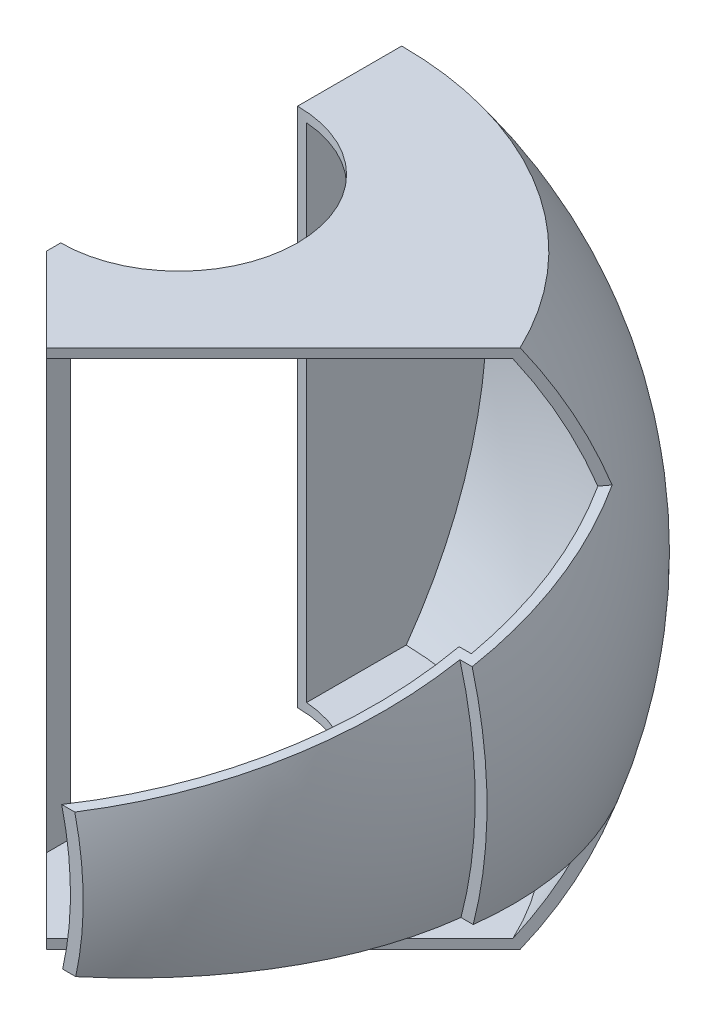
ISO-10303-21;
HEADER;
FILE_DESCRIPTION(('STEP AP214'),'2;1');
FILE_NAME('part.step','',(''),(''),'','','');
FILE_SCHEMA(('AUTOMOTIVE_DESIGN { 1 0 10303 214 1 1 1 1 }'));
ENDSEC;
DATA;
#1=APPLICATION_CONTEXT('core data for automotive mechanical design processes');
#2=APPLICATION_PROTOCOL_DEFINITION('international standard','automotive_design',2000,#1);
#3=PRODUCT_CONTEXT('',#1,'mechanical');
#4=PRODUCT('Part','Part','',(#3));
#5=PRODUCT_RELATED_PRODUCT_CATEGORY('part','',(#4));
#6=PRODUCT_DEFINITION_FORMATION('','',#4);
#7=PRODUCT_DEFINITION_CONTEXT('part definition',#1,'design');
#8=PRODUCT_DEFINITION('design','',#6,#7);
#9=PRODUCT_DEFINITION_SHAPE('','',#8);
#10=(LENGTH_UNIT() NAMED_UNIT(*) SI_UNIT(.MILLI.,.METRE.));
#11=(NAMED_UNIT(*) PLANE_ANGLE_UNIT() SI_UNIT($,.RADIAN.));
#12=(NAMED_UNIT(*) SI_UNIT($,.STERADIAN.) SOLID_ANGLE_UNIT());
#13=UNCERTAINTY_MEASURE_WITH_UNIT(LENGTH_MEASURE(1.E-05),#10,'distance_accuracy_value','');
#14=(GEOMETRIC_REPRESENTATION_CONTEXT(3) GLOBAL_UNCERTAINTY_ASSIGNED_CONTEXT((#13)) GLOBAL_UNIT_ASSIGNED_CONTEXT((#10,
#11,#12)) REPRESENTATION_CONTEXT('',''));
#15=CARTESIAN_POINT('',(0.,0.,0.));
#16=DIRECTION('',(0.,0.,1.));
#17=DIRECTION('',(1.,0.,0.));
#18=AXIS2_PLACEMENT_3D('',#15,#16,#17);
#19=CARTESIAN_POINT('',(-5.2024663463513E-13,55.,-28.));
#20=DIRECTION('',(0.,-1.,0.));
#21=DIRECTION('',(0.,0.,-1.));
#22=AXIS2_PLACEMENT_3D('',#19,#20,#21);
#23=CYLINDRICAL_SURFACE('',#22,25.);
#24=DIRECTION('',(0.,-1.,0.));
#25=VECTOR('',#24,1.);
#26=CARTESIAN_POINT('',(-3.70097021917372E-13,55.,-53.));
#27=LINE('',#26,#25);
#28=CARTESIAN_POINT('',(-3.70097021917372E-13,55.,-53.));
#29=VERTEX_POINT('',#28);
#30=CARTESIAN_POINT('',(-3.70097021917372E-13,-55.,-53.));
#31=VERTEX_POINT('',#30);
#32=EDGE_CURVE('E259',#29,#31,#27,.T.);
#33=ORIENTED_EDGE('',*,*,#32,.T.);
#34=CARTESIAN_POINT('',(-5.2024663463513E-13,-55.,-28.));
#35=DIRECTION('',(0.,-1.,0.));
#36=DIRECTION('',(0.,0.,-1.));
#37=AXIS2_PLACEMENT_3D('',#34,#35,#36);
#38=CIRCLE('',#37,25.);
#39=CARTESIAN_POINT('',(0.,-55.,-3.));
#40=VERTEX_POINT('',#39);
#41=EDGE_CURVE('E239',#31,#40,#38,.T.);
#42=ORIENTED_EDGE('',*,*,#41,.T.);
#43=DIRECTION('',(0.,-1.,0.));
#44=VECTOR('',#43,1.);
#45=CARTESIAN_POINT('',(0.,55.,-3.));
#46=LINE('',#45,#44);
#47=CARTESIAN_POINT('',(0.,55.,-3.));
#48=VERTEX_POINT('',#47);
#49=EDGE_CURVE('E256',#40,#48,#46,.F.);
#50=ORIENTED_EDGE('',*,*,#49,.T.);
#51=CARTESIAN_POINT('',(-5.2024663463513E-13,55.,-28.));
#52=DIRECTION('',(0.,-1.,0.));
#53=DIRECTION('',(0.,0.,-1.));
#54=AXIS2_PLACEMENT_3D('',#51,#52,#53);
#55=CIRCLE('',#54,25.);
#56=EDGE_CURVE('E253',#29,#48,#55,.T.);
#57=ORIENTED_EDGE('',*,*,#56,.F.);
#58=EDGE_LOOP('',(#33,#42,#50,#57));
#59=FACE_BOUND('',#58,.T.);
#60=DIRECTION('',(0.,-1.,0.));
#61=VECTOR('',#60,1.);
#62=CARTESIAN_POINT('',(1.99999999999963,53.,-52.9198715887542));
#63=LINE('',#62,#61);
#64=CARTESIAN_POINT('',(1.99999999999963,53.,-52.9198715887542));
#65=VERTEX_POINT('',#64);
#66=CARTESIAN_POINT('',(1.99999999999963,-53.,-52.9198715887542));
#67=VERTEX_POINT('',#66);
#68=EDGE_CURVE('E219',#65,#67,#63,.T.);
#69=ORIENTED_EDGE('',*,*,#68,.F.);
#70=CARTESIAN_POINT('',(-5.2024663463513E-13,53.,-28.));
#71=DIRECTION('',(0.,-1.,0.));
#72=DIRECTION('',(0.,0.,-1.));
#73=AXIS2_PLACEMENT_3D('',#70,#71,#72);
#74=CIRCLE('',#73,25.);
#75=CARTESIAN_POINT('',(1.99999999999998,53.,-3.08012841124581));
#76=VERTEX_POINT('',#75);
#77=EDGE_CURVE('E186',#65,#76,#74,.T.);
#78=ORIENTED_EDGE('',*,*,#77,.T.);
#79=DIRECTION('',(0.,-1.,0.));
#80=VECTOR('',#79,1.);
#81=CARTESIAN_POINT('',(1.99999999999998,-53.,-3.08012841124581));
#82=LINE('',#81,#80);
#83=CARTESIAN_POINT('',(1.99999999999998,-53.,-3.08012841124581));
#84=VERTEX_POINT('',#83);
#85=EDGE_CURVE('E221',#84,#76,#82,.F.);
#86=ORIENTED_EDGE('',*,*,#85,.F.);
#87=CARTESIAN_POINT('',(-5.2024663463513E-13,-53.,-28.));
#88=DIRECTION('',(0.,1.,0.));
#89=DIRECTION('',(0.,0.,1.));
#90=AXIS2_PLACEMENT_3D('',#87,#88,#89);
#91=CIRCLE('',#90,25.);
#92=EDGE_CURVE('E222',#67,#84,#91,.F.);
#93=ORIENTED_EDGE('',*,*,#92,.F.);
#94=EDGE_LOOP('',(#69,#78,#86,#93));
#95=FACE_BOUND('',#94,.T.);
#96=ADVANCED_FACE('F43',(#59,#95),#23,.F.);
#97=CARTESIAN_POINT('',(0.,0.,0.));
#98=DIRECTION('',(-1.,0.,0.));
#99=DIRECTION('',(0.,0.,1.));
#100=AXIS2_PLACEMENT_3D('',#97,#98,#99);
#101=PLANE('',#100);
#102=ORIENTED_EDGE('',*,*,#32,.F.);
#103=DIRECTION('',(0.,0.,-1.));
#104=VECTOR('',#103,1.);
#105=CARTESIAN_POINT('',(0.,55.,0.));
#106=LINE('',#105,#104);
#107=CARTESIAN_POINT('',(-5.23675645672742E-13,55.,-74.9933330370107));
#108=VERTEX_POINT('',#107);
#109=EDGE_CURVE('E325',#29,#108,#106,.T.);
#110=ORIENTED_EDGE('',*,*,#109,.T.);
#111=CARTESIAN_POINT('',(0.,0.,0.));
#112=DIRECTION('',(-1.,0.,0.));
#113=DIRECTION('',(0.,0.,1.));
#114=AXIS2_PLACEMENT_3D('',#111,#112,#113);
#115=CIRCLE('',#114,93.);
#116=CARTESIAN_POINT('',(-5.23675645672742E-13,-55.,-74.9933330370107));
#117=VERTEX_POINT('',#116);
#118=EDGE_CURVE('E290',#108,#117,#115,.T.);
#119=ORIENTED_EDGE('',*,*,#118,.T.);
#120=DIRECTION('',(0.,0.,1.));
#121=VECTOR('',#120,1.);
#122=CARTESIAN_POINT('',(0.,-55.,0.));
#123=LINE('',#122,#121);
#124=EDGE_CURVE('E322',#117,#31,#123,.T.);
#125=ORIENTED_EDGE('',*,*,#124,.T.);
#126=EDGE_LOOP('',(#102,#110,#119,#125));
#127=FACE_BOUND('',#126,.T.);
#128=ADVANCED_FACE('F400',(#127),#101,.T.);
#129=CARTESIAN_POINT('',(-121.513111323989,15.4248311153682,60.));
#130=DIRECTION('',(0.,0.990074030670296,0.140546838428599));
#131=DIRECTION('',(0.,-0.140546838428599,0.990074030670296));
#132=AXIS2_PLACEMENT_3D('',#129,#130,#131);
#133=PLANE('',#132);
#134=CARTESIAN_POINT('',(0.,23.4692445329286,3.33159745355368));
#135=DIRECTION('',(0.,0.990074030670296,0.140546838428599));
#136=DIRECTION('',(0.,-0.140546838428599,0.990074030670296));
#137=AXIS2_PLACEMENT_3D('',#134,#135,#136);
#138=CIRCLE('',#137,85.266318200454);
#139=CARTESIAN_POINT('',(63.2006691820772,15.4248311153682,60.));
#140=VERTEX_POINT('',#139);
#141=CARTESIAN_POINT('',(85.0961001669933,24.226096185086,-2.0000000000003));
#142=VERTEX_POINT('',#141);
#143=EDGE_CURVE('E209',#140,#142,#138,.T.);
#144=ORIENTED_EDGE('',*,*,#143,.F.);
#145=DIRECTION('',(1.,0.,0.));
#146=VECTOR('',#145,1.);
#147=CARTESIAN_POINT('',(-121.513111323989,15.4248311153682,60.));
#148=LINE('',#147,#146);
#149=CARTESIAN_POINT('',(65.9721500715443,15.4248311153682,60.));
#150=VERTEX_POINT('',#149);
#151=EDGE_CURVE('E293',#140,#150,#148,.T.);
#152=ORIENTED_EDGE('',*,*,#151,.T.);
#153=CARTESIAN_POINT('',(0.,23.4692445329286,3.33159745355368));
#154=DIRECTION('',(0.,0.990074030670296,0.140546838428599));
#155=DIRECTION('',(0.,-0.140546838428599,0.990074030670296));
#156=AXIS2_PLACEMENT_3D('',#153,#154,#155);
#157=CIRCLE('',#156,87.3403974084219);
#158=CARTESIAN_POINT('',(87.275551019415,23.9421844086435,-3.04720957721539E-13));
#159=VERTEX_POINT('',#158);
#160=EDGE_CURVE('E271',#150,#159,#157,.T.);
#161=ORIENTED_EDGE('',*,*,#160,.T.);
#162=DIRECTION('',(-1.,0.,0.));
#163=VECTOR('',#162,1.);
#164=CARTESIAN_POINT('',(-121.513111323989,23.9421844086434,4.23272528138341E-13));
#165=LINE('',#164,#163);
#166=CARTESIAN_POINT('',(89.8652981174742,23.9421844086435,-3.13657139834772E-13));
#167=VERTEX_POINT('',#166);
#168=EDGE_CURVE('E266',#167,#159,#165,.T.);
#169=ORIENTED_EDGE('',*,*,#168,.F.);
#170=CARTESIAN_POINT('',(0.,23.4692445329286,3.33159745355368));
#171=DIRECTION('',(0.,0.990074030670296,0.140546838428599));
#172=DIRECTION('',(0.,-0.140546838428599,0.990074030670296));
#173=AXIS2_PLACEMENT_3D('',#170,#171,#172);
#174=CIRCLE('',#173,89.928277084914);
#175=CARTESIAN_POINT('',(77.3831743114521,29.9082830918752,-42.0278352521239));
#176=VERTEX_POINT('',#175);
#177=EDGE_CURVE('E282',#167,#176,#174,.T.);
#178=ORIENTED_EDGE('',*,*,#177,.T.);
#179=DIRECTION('',(0.703571165799075,0.0998760697678693,-0.703571165799064));
#180=VECTOR('',#179,1.);
#181=CARTESIAN_POINT('',(20.0364386421746,21.7675762933536,15.3189004171528));
#182=LINE('',#181,#180);
#183=CARTESIAN_POINT('',(75.8766441195315,29.694422260349,-40.5213050602033));
#184=VERTEX_POINT('',#183);
#185=EDGE_CURVE('E300',#184,#176,#182,.T.);
#186=ORIENTED_EDGE('',*,*,#185,.F.);
#187=CARTESIAN_POINT('',(0.,23.4692445329286,3.33159745355368));
#188=DIRECTION('',(0.,0.990074030670296,0.140546838428599));
#189=DIRECTION('',(0.,-0.140546838428599,0.990074030670296));
#190=AXIS2_PLACEMENT_3D('',#187,#188,#189);
#191=CIRCLE('',#190,87.858380473698);
#192=CARTESIAN_POINT('',(87.6931939413257,24.226096185086,-2.00000000000031));
#193=VERTEX_POINT('',#192);
#194=EDGE_CURVE('E207',#193,#184,#191,.T.);
#195=ORIENTED_EDGE('',*,*,#194,.F.);
#196=DIRECTION('',(-1.,0.,0.));
#197=VECTOR('',#196,1.);
#198=CARTESIAN_POINT('',(-121.513111323989,24.2260961850859,-1.99999999999957));
#199=LINE('',#198,#197);
#200=EDGE_CURVE('E235',#193,#142,#199,.T.);
#201=ORIENTED_EDGE('',*,*,#200,.T.);
#202=EDGE_LOOP('',(#144,#152,#161,#169,#178,#186,#195,#201));
#203=FACE_BOUND('',#202,.T.);
#204=ADVANCED_FACE('F338',(#203),#133,.T.);
#205=CARTESIAN_POINT('',(-121.513111323989,-14.5751688846318,60.));
#206=DIRECTION('',(0.,-0.990074030670296,0.140546838428599));
#207=DIRECTION('',(0.,-0.140546838428599,-0.990074030670296));
#208=AXIS2_PLACEMENT_3D('',#205,#206,#207);
#209=PLANE('',#208);
#210=CARTESIAN_POINT('',(0.,-22.6363660318196,3.21336544614836));
#211=DIRECTION('',(0.,-0.990074030670296,0.140546838428599));
#212=DIRECTION('',(0.,-0.140546838428599,-0.990074030670296));
#213=AXIS2_PLACEMENT_3D('',#210,#211,#212);
#214=CIRCLE('',#213,85.4957262989384);
#215=CARTESIAN_POINT('',(85.333418632901,-23.3764339543496,-2.0000000000003));
#216=VERTEX_POINT('',#215);
#217=CARTESIAN_POINT('',(63.4020066873633,-14.5751688846318,60.));
#218=VERTEX_POINT('',#217);
#219=EDGE_CURVE('E236',#216,#218,#214,.T.);
#220=ORIENTED_EDGE('',*,*,#219,.F.);
#221=DIRECTION('',(1.,0.,0.));
#222=VECTOR('',#221,1.);
#223=CARTESIAN_POINT('',(-121.513111323989,-23.3764339543495,-1.99999999999958));
#224=LINE('',#223,#222);
#225=CARTESIAN_POINT('',(87.9235027485708,-23.3764339543496,-2.00000000000031));
#226=VERTEX_POINT('',#225);
#227=EDGE_CURVE('E218',#216,#226,#224,.T.);
#228=ORIENTED_EDGE('',*,*,#227,.T.);
#229=CARTESIAN_POINT('',(0.,-22.6363660318196,3.21336544614836));
#230=DIRECTION('',(0.,-0.990074030670296,0.140546838428599));
#231=DIRECTION('',(0.,-0.140546838428599,-0.990074030670296));
#232=AXIS2_PLACEMENT_3D('',#229,#230,#231);
#233=CIRCLE('',#232,88.0810377742167);
#234=CARTESIAN_POINT('',(76.082684812944,-28.8740087192557,-40.7273457536158));
#235=VERTEX_POINT('',#234);
#236=EDGE_CURVE('E203',#235,#226,#233,.T.);
#237=ORIENTED_EDGE('',*,*,#236,.F.);
#238=DIRECTION('',(-0.703571165799075,0.0998760697678691,0.703571165799064));
#239=VECTOR('',#238,1.);
#240=CARTESIAN_POINT('',(12.3664528289492,-19.8291144138564,22.9888862303781));
#241=LINE('',#240,#239);
#242=CARTESIAN_POINT('',(77.5856219144432,-29.0873594904397,-42.2302828551149));
#243=VERTEX_POINT('',#242);
#244=EDGE_CURVE('E296',#243,#235,#241,.T.);
#245=ORIENTED_EDGE('',*,*,#244,.F.);
#246=CARTESIAN_POINT('',(0.,-22.6363660318196,3.21336544614836));
#247=DIRECTION('',(0.,-0.990074030670296,0.140546838428599));
#248=DIRECTION('',(0.,-0.140546838428599,-0.990074030670296));
#249=AXIS2_PLACEMENT_3D('',#246,#247,#248);
#250=CIRCLE('',#249,90.1458219518963);
#251=CARTESIAN_POINT('',(90.0873765821986,-23.0925221779071,-3.14695352545935E-13));
#252=VERTEX_POINT('',#251);
#253=EDGE_CURVE('E279',#243,#252,#250,.T.);
#254=ORIENTED_EDGE('',*,*,#253,.T.);
#255=DIRECTION('',(1.,0.,0.));
#256=VECTOR('',#255,1.);
#257=CARTESIAN_POINT('',(-121.513111323989,-23.092522177907,4.23272528138341E-13));
#258=LINE('',#257,#256);
#259=CARTESIAN_POINT('',(87.5042022960205,-23.0925221779071,-3.0551928938691E-13));
#260=VERTEX_POINT('',#259);
#261=EDGE_CURVE('E264',#260,#252,#258,.T.);
#262=ORIENTED_EDGE('',*,*,#261,.F.);
#263=CARTESIAN_POINT('',(0.,-22.6363660318196,3.21336544614836));
#264=DIRECTION('',(0.,-0.990074030670296,0.140546838428599));
#265=DIRECTION('',(0.,-0.140546838428599,-0.990074030670296));
#266=AXIS2_PLACEMENT_3D('',#263,#264,#265);
#267=CIRCLE('',#266,87.5643718379969);
#268=CARTESIAN_POINT('',(66.1650546133263,-14.5751688846318,60.));
#269=VERTEX_POINT('',#268);
#270=EDGE_CURVE('E268',#260,#269,#267,.T.);
#271=ORIENTED_EDGE('',*,*,#270,.T.);
#272=DIRECTION('',(1.,0.,0.));
#273=VECTOR('',#272,1.);
#274=CARTESIAN_POINT('',(-121.513111323989,-14.5751688846318,60.));
#275=LINE('',#274,#273);
#276=EDGE_CURVE('E294',#218,#269,#275,.T.);
#277=ORIENTED_EDGE('',*,*,#276,.F.);
#278=EDGE_LOOP('',(#220,#228,#237,#245,#254,#262,#271,#277));
#279=FACE_BOUND('',#278,.T.);
#280=ADVANCED_FACE('F396',(#279),#209,.T.);
#281=CARTESIAN_POINT('',(-121.513111323989,-14.5751688846318,60.));
#282=DIRECTION('',(0.,0.,1.));
#283=DIRECTION('',(0.,-1.,0.));
#284=AXIS2_PLACEMENT_3D('',#281,#282,#283);
#285=PLANE('',#284);
#286=CARTESIAN_POINT('',(0.,0.,60.));
#287=DIRECTION('',(0.,0.,1.));
#288=DIRECTION('',(0.,-1.,0.));
#289=AXIS2_PLACEMENT_3D('',#286,#287,#288);
#290=CIRCLE('',#289,65.0557453266043);
#291=EDGE_CURVE('E215',#218,#140,#290,.T.);
#292=ORIENTED_EDGE('',*,*,#291,.F.);
#293=ORIENTED_EDGE('',*,*,#276,.T.);
#294=CARTESIAN_POINT('',(0.,0.,60.));
#295=DIRECTION('',(0.,0.,1.));
#296=DIRECTION('',(0.,-1.,0.));
#297=AXIS2_PLACEMENT_3D('',#294,#295,#296);
#298=CIRCLE('',#297,67.7513837497065);
#299=EDGE_CURVE('E11',#269,#150,#298,.T.);
#300=ORIENTED_EDGE('',*,*,#299,.T.);
#301=ORIENTED_EDGE('',*,*,#151,.F.);
#302=EDGE_LOOP('',(#292,#293,#300,#301));
#303=FACE_BOUND('',#302,.T.);
#304=ADVANCED_FACE('F390',(#303),#285,.T.);
#305=CARTESIAN_POINT('',(17.6776695296636,55.,17.6776695296638));
#306=DIRECTION('',(-0.707106781186542,0.,-0.707106781186553));
#307=DIRECTION('',(-0.707106781186553,0.,0.707106781186542));
#308=AXIS2_PLACEMENT_3D('',#305,#306,#307);
#309=PLANE('',#308);
#310=DIRECTION('',(0.707106781186553,0.,-0.707106781186542));
#311=VECTOR('',#310,1.);
#312=CARTESIAN_POINT('',(17.6776695296636,53.,17.6776695296638));
#313=LINE('',#312,#311);
#314=CARTESIAN_POINT('',(17.6776695296636,53.,17.6776695296638));
#315=VERTEX_POINT('',#314);
#316=CARTESIAN_POINT('',(66.9067259902543,53.,-31.5513869309262));
#317=VERTEX_POINT('',#316);
#318=EDGE_CURVE('E246',#315,#317,#313,.T.);
#319=ORIENTED_EDGE('',*,*,#318,.T.);
#320=CARTESIAN_POINT('',(17.6776695296636,0.,17.6776695296638));
#321=DIRECTION('',(-0.707106781186542,0.,-0.707106781186553));
#322=DIRECTION('',(-0.707106781186553,0.,0.707106781186542));
#323=AXIS2_PLACEMENT_3D('',#320,#321,#322);
#324=CIRCLE('',#323,87.4985714169094);
#325=EDGE_CURVE('E198',#317,#184,#324,.T.);
#326=ORIENTED_EDGE('',*,*,#325,.T.);
#327=ORIENTED_EDGE('',*,*,#185,.T.);
#328=CARTESIAN_POINT('',(17.6776695296636,0.,17.6776695296638));
#329=DIRECTION('',(-0.707106781186542,0.,-0.707106781186553));
#330=DIRECTION('',(-0.707106781186553,0.,0.707106781186542));
#331=AXIS2_PLACEMENT_3D('',#328,#329,#330);
#332=CIRCLE('',#331,89.5767827062348);
#333=CARTESIAN_POINT('',(67.6726692796389,55.,-32.3173302203108));
#334=VERTEX_POINT('',#333);
#335=EDGE_CURVE('E287',#334,#176,#332,.T.);
#336=ORIENTED_EDGE('',*,*,#335,.F.);
#337=DIRECTION('',(0.707106781186553,0.,-0.707106781186542));
#338=VECTOR('',#337,1.);
#339=CARTESIAN_POINT('',(17.6776695296636,55.,17.6776695296638));
#340=LINE('',#339,#338);
#341=CARTESIAN_POINT('',(17.6776695296636,55.,17.6776695296638));
#342=VERTEX_POINT('',#341);
#343=EDGE_CURVE('E306',#342,#334,#340,.T.);
#344=ORIENTED_EDGE('',*,*,#343,.F.);
#345=DIRECTION('',(0.,-1.,0.));
#346=VECTOR('',#345,1.);
#347=CARTESIAN_POINT('',(17.6776695296636,55.,17.6776695296638));
#348=LINE('',#347,#346);
#349=EDGE_CURVE('E319',#342,#315,#348,.T.);
#350=ORIENTED_EDGE('',*,*,#349,.T.);
#351=EDGE_LOOP('',(#319,#326,#327,#336,#344,#350));
#352=FACE_BOUND('',#351,.T.);
#353=ADVANCED_FACE('F347',(#352),#309,.F.);
#354=ORIENTED_EDGE('',*,*,#49,.F.);
#355=CARTESIAN_POINT('',(0.,-55.,0.));
#356=VERTEX_POINT('',#355);
#357=EDGE_CURVE('E318',#40,#356,#123,.T.);
#358=ORIENTED_EDGE('',*,*,#357,.T.);
#359=DIRECTION('',(0.,-1.,0.));
#360=VECTOR('',#359,1.);
#361=CARTESIAN_POINT('',(0.,55.,0.));
#362=LINE('',#361,#360);
#363=CARTESIAN_POINT('',(0.,55.,0.));
#364=VERTEX_POINT('',#363);
#365=EDGE_CURVE('E315',#364,#356,#362,.T.);
#366=ORIENTED_EDGE('',*,*,#365,.F.);
#367=EDGE_CURVE('E326',#364,#48,#106,.T.);
#368=ORIENTED_EDGE('',*,*,#367,.T.);
#369=EDGE_LOOP('',(#354,#358,#366,#368));
#370=FACE_BOUND('',#369,.T.);
#371=ADVANCED_FACE('F357',(#370),#101,.T.);
#372=CARTESIAN_POINT('',(0.,-55.,0.));
#373=DIRECTION('',(0.,1.,0.));
#374=DIRECTION('',(0.,0.,1.));
#375=AXIS2_PLACEMENT_3D('',#372,#373,#374);
#376=PLANE('',#375);
#377=ORIENTED_EDGE('',*,*,#357,.F.);
#378=ORIENTED_EDGE('',*,*,#41,.F.);
#379=ORIENTED_EDGE('',*,*,#124,.F.);
#380=CARTESIAN_POINT('',(0.,-55.,0.));
#381=DIRECTION('',(0.,-1.,0.));
#382=DIRECTION('',(0.,0.,-1.));
#383=AXIS2_PLACEMENT_3D('',#380,#381,#382);
#384=CIRCLE('',#383,74.9933330370107);
#385=CARTESIAN_POINT('',(67.6726692796389,-55.,-32.3173302203108));
#386=VERTEX_POINT('',#385);
#387=EDGE_CURVE('E274',#117,#386,#384,.T.);
#388=ORIENTED_EDGE('',*,*,#387,.T.);
#389=DIRECTION('',(0.707106781186553,0.,-0.707106781186542));
#390=VECTOR('',#389,1.);
#391=CARTESIAN_POINT('',(17.6776695296636,-55.,17.6776695296638));
#392=LINE('',#391,#390);
#393=CARTESIAN_POINT('',(17.6776695296636,-55.,17.6776695296638));
#394=VERTEX_POINT('',#393);
#395=EDGE_CURVE('E307',#394,#386,#392,.T.);
#396=ORIENTED_EDGE('',*,*,#395,.F.);
#397=DIRECTION('',(0.707106781186542,0.,0.707106781186553));
#398=VECTOR('',#397,1.);
#399=CARTESIAN_POINT('',(0.,-55.,0.));
#400=LINE('',#399,#398);
#401=EDGE_CURVE('E302',#356,#394,#400,.T.);
#402=ORIENTED_EDGE('',*,*,#401,.F.);
#403=EDGE_LOOP('',(#377,#378,#379,#388,#396,#402));
#404=FACE_BOUND('',#403,.T.);
#405=ADVANCED_FACE('F361',(#404),#376,.F.);
#406=CARTESIAN_POINT('',(0.,55.,0.));
#407=DIRECTION('',(0.,-1.,0.));
#408=DIRECTION('',(0.,0.,-1.));
#409=AXIS2_PLACEMENT_3D('',#406,#407,#408);
#410=PLANE('',#409);
#411=ORIENTED_EDGE('',*,*,#109,.F.);
#412=ORIENTED_EDGE('',*,*,#56,.T.);
#413=ORIENTED_EDGE('',*,*,#367,.F.);
#414=DIRECTION('',(0.707106781186542,0.,0.707106781186553));
#415=VECTOR('',#414,1.);
#416=CARTESIAN_POINT('',(0.,55.,0.));
#417=LINE('',#416,#415);
#418=EDGE_CURVE('E303',#364,#342,#417,.T.);
#419=ORIENTED_EDGE('',*,*,#418,.T.);
#420=ORIENTED_EDGE('',*,*,#343,.T.);
#421=CARTESIAN_POINT('',(0.,55.,0.));
#422=DIRECTION('',(0.,-1.,0.));
#423=DIRECTION('',(0.,0.,-1.));
#424=AXIS2_PLACEMENT_3D('',#421,#422,#423);
#425=CIRCLE('',#424,74.9933330370107);
#426=EDGE_CURVE('E277',#108,#334,#425,.T.);
#427=ORIENTED_EDGE('',*,*,#426,.F.);
#428=EDGE_LOOP('',(#411,#412,#413,#419,#420,#427));
#429=FACE_BOUND('',#428,.T.);
#430=ADVANCED_FACE('F45',(#429),#410,.F.);
#431=ORIENTED_EDGE('',*,*,#244,.T.);
#432=CARTESIAN_POINT('',(17.6776695296636,0.,17.6776695296638));
#433=DIRECTION('',(-0.707106781186542,0.,-0.707106781186553));
#434=DIRECTION('',(-0.707106781186553,0.,0.707106781186542));
#435=AXIS2_PLACEMENT_3D('',#432,#433,#434);
#436=CIRCLE('',#435,87.4985714169094);
#437=CARTESIAN_POINT('',(66.9067259902543,-53.,-31.5513869309262));
#438=VERTEX_POINT('',#437);
#439=EDGE_CURVE('E230',#235,#438,#436,.T.);
#440=ORIENTED_EDGE('',*,*,#439,.T.);
#441=DIRECTION('',(0.707106781186553,0.,-0.707106781186542));
#442=VECTOR('',#441,1.);
#443=CARTESIAN_POINT('',(17.6776695296636,-53.,17.6776695296638));
#444=LINE('',#443,#442);
#445=CARTESIAN_POINT('',(17.6776695296636,-53.,17.6776695296638));
#446=VERTEX_POINT('',#445);
#447=EDGE_CURVE('E226',#446,#438,#444,.T.);
#448=ORIENTED_EDGE('',*,*,#447,.F.);
#449=EDGE_CURVE('E310',#446,#394,#348,.T.);
#450=ORIENTED_EDGE('',*,*,#449,.T.);
#451=ORIENTED_EDGE('',*,*,#395,.T.);
#452=CARTESIAN_POINT('',(17.6776695296636,0.,17.6776695296638));
#453=DIRECTION('',(-0.707106781186542,0.,-0.707106781186553));
#454=DIRECTION('',(-0.707106781186553,0.,0.707106781186542));
#455=AXIS2_PLACEMENT_3D('',#452,#453,#454);
#456=CIRCLE('',#455,89.5767827062348);
#457=EDGE_CURVE('E285',#243,#386,#456,.T.);
#458=ORIENTED_EDGE('',*,*,#457,.F.);
#459=EDGE_LOOP('',(#431,#440,#448,#450,#451,#458));
#460=FACE_BOUND('',#459,.T.);
#461=ADVANCED_FACE('F368',(#460),#309,.F.);
#462=CARTESIAN_POINT('',(0.,55.,0.));
#463=DIRECTION('',(0.707106781186553,0.,-0.707106781186542));
#464=DIRECTION('',(-0.707106781186542,0.,-0.707106781186553));
#465=AXIS2_PLACEMENT_3D('',#462,#463,#464);
#466=PLANE('',#465);
#467=DIRECTION('',(0.,-1.,0.));
#468=VECTOR('',#467,1.);
#469=CARTESIAN_POINT('',(2.00000000000001,0.,2.00000000000004));
#470=LINE('',#469,#468);
#471=CARTESIAN_POINT('',(2.00000000000001,53.,2.00000000000004));
#472=VERTEX_POINT('',#471);
#473=CARTESIAN_POINT('',(2.00000000000001,-53.,2.00000000000004));
#474=VERTEX_POINT('',#473);
#475=EDGE_CURVE('E58',#472,#474,#470,.T.);
#476=ORIENTED_EDGE('',*,*,#475,.F.);
#477=DIRECTION('',(0.707106781186542,0.,0.707106781186553));
#478=VECTOR('',#477,1.);
#479=CARTESIAN_POINT('',(0.,53.,0.));
#480=LINE('',#479,#478);
#481=EDGE_CURVE('E229',#472,#315,#480,.T.);
#482=ORIENTED_EDGE('',*,*,#481,.T.);
#483=ORIENTED_EDGE('',*,*,#349,.F.);
#484=ORIENTED_EDGE('',*,*,#418,.F.);
#485=ORIENTED_EDGE('',*,*,#365,.T.);
#486=ORIENTED_EDGE('',*,*,#401,.T.);
#487=ORIENTED_EDGE('',*,*,#449,.F.);
#488=DIRECTION('',(0.707106781186542,0.,0.707106781186553));
#489=VECTOR('',#488,1.);
#490=CARTESIAN_POINT('',(0.,-53.,0.));
#491=LINE('',#490,#489);
#492=EDGE_CURVE('E197',#474,#446,#491,.T.);
#493=ORIENTED_EDGE('',*,*,#492,.F.);
#494=EDGE_LOOP('',(#476,#482,#483,#484,#485,#486,#487,#493));
#495=FACE_BOUND('',#494,.T.);
#496=ADVANCED_FACE('F353',(#495),#466,.F.);
#497=CARTESIAN_POINT('',(0.,0.,0.));
#498=DIRECTION('',(0.,-1.,0.));
#499=DIRECTION('',(0.,0.,1.));
#500=AXIS2_PLACEMENT_3D('',#497,#498,#499);
#501=SPHERICAL_SURFACE('',#500,93.);
#502=CARTESIAN_POINT('',(0.,0.,0.));
#503=DIRECTION('',(0.,0.,-1.));
#504=DIRECTION('',(-1.,0.,0.));
#505=AXIS2_PLACEMENT_3D('',#502,#503,#504);
#506=CIRCLE('',#505,93.);
#507=EDGE_CURVE('E51',#252,#167,#506,.F.);
#508=ORIENTED_EDGE('',*,*,#507,.F.);
#509=ORIENTED_EDGE('',*,*,#253,.F.);
#510=ORIENTED_EDGE('',*,*,#457,.T.);
#511=ORIENTED_EDGE('',*,*,#387,.F.);
#512=ORIENTED_EDGE('',*,*,#118,.F.);
#513=ORIENTED_EDGE('',*,*,#426,.T.);
#514=ORIENTED_EDGE('',*,*,#335,.T.);
#515=ORIENTED_EDGE('',*,*,#177,.F.);
#516=EDGE_LOOP('',(#508,#509,#510,#511,#512,#513,#514,#515));
#517=FACE_BOUND('',#516,.T.);
#518=ADVANCED_FACE('F341',(#517),#501,.T.);
#519=CARTESIAN_POINT('',(0.,0.,0.));
#520=DIRECTION('',(0.,-1.,0.));
#521=DIRECTION('',(1.,0.,0.));
#522=AXIS2_PLACEMENT_3D('',#519,#520,#521);
#523=SPHERICAL_SURFACE('',#522,90.5);
#524=ORIENTED_EDGE('',*,*,#299,.F.);
#525=ORIENTED_EDGE('',*,*,#270,.F.);
#526=CARTESIAN_POINT('',(0.,0.,0.));
#527=DIRECTION('',(0.,0.,1.));
#528=DIRECTION('',(-1.,0.,0.));
#529=AXIS2_PLACEMENT_3D('',#526,#527,#528);
#530=CIRCLE('',#529,90.5);
#531=EDGE_CURVE('E261',#260,#159,#530,.T.);
#532=ORIENTED_EDGE('',*,*,#531,.T.);
#533=ORIENTED_EDGE('',*,*,#160,.F.);
#534=EDGE_LOOP('',(#524,#525,#532,#533));
#535=FACE_BOUND('',#534,.T.);
#536=ADVANCED_FACE('F394',(#535),#523,.T.);
#537=CARTESIAN_POINT('',(0.,0.,0.));
#538=DIRECTION('',(0.,0.,-1.));
#539=DIRECTION('',(-1.,0.,0.));
#540=AXIS2_PLACEMENT_3D('',#537,#538,#539);
#541=PLANE('',#540);
#542=ORIENTED_EDGE('',*,*,#168,.T.);
#543=ORIENTED_EDGE('',*,*,#531,.F.);
#544=ORIENTED_EDGE('',*,*,#261,.T.);
#545=ORIENTED_EDGE('',*,*,#507,.T.);
#546=EDGE_LOOP('',(#542,#543,#544,#545));
#547=FACE_BOUND('',#546,.T.);
#548=ADVANCED_FACE('F331',(#547),#541,.F.);
#549=CARTESIAN_POINT('',(2.,0.,0.));
#550=DIRECTION('',(-1.,0.,0.));
#551=DIRECTION('',(0.,0.,1.));
#552=AXIS2_PLACEMENT_3D('',#549,#550,#551);
#553=PLANE('',#552);
#554=ORIENTED_EDGE('',*,*,#68,.T.);
#555=DIRECTION('',(0.,0.,1.));
#556=VECTOR('',#555,1.);
#557=CARTESIAN_POINT('',(2.,-53.,0.));
#558=LINE('',#557,#556);
#559=CARTESIAN_POINT('',(1.99999999999948,-53.,-73.9459261893446));
#560=VERTEX_POINT('',#559);
#561=EDGE_CURVE('E189',#560,#67,#558,.T.);
#562=ORIENTED_EDGE('',*,*,#561,.F.);
#563=CARTESIAN_POINT('',(2.,0.,0.));
#564=DIRECTION('',(-1.,0.,0.));
#565=DIRECTION('',(0.,0.,1.));
#566=AXIS2_PLACEMENT_3D('',#563,#564,#565);
#567=CIRCLE('',#566,90.9780193233508);
#568=CARTESIAN_POINT('',(1.99999999999948,53.,-73.9459261893446));
#569=VERTEX_POINT('',#568);
#570=EDGE_CURVE('E193',#569,#560,#567,.T.);
#571=ORIENTED_EDGE('',*,*,#570,.F.);
#572=DIRECTION('',(0.,0.,-1.));
#573=VECTOR('',#572,1.);
#574=CARTESIAN_POINT('',(2.,53.,0.));
#575=LINE('',#574,#573);
#576=EDGE_CURVE('E179',#65,#569,#575,.T.);
#577=ORIENTED_EDGE('',*,*,#576,.F.);
#578=EDGE_LOOP('',(#554,#562,#571,#577));
#579=FACE_BOUND('',#578,.T.);
#580=ADVANCED_FACE('F194',(#579),#553,.F.);
#581=ORIENTED_EDGE('',*,*,#85,.T.);
#582=DIRECTION('',(0.,0.,-1.));
#583=VECTOR('',#582,1.);
#584=CARTESIAN_POINT('',(2.,53.,0.));
#585=LINE('',#584,#583);
#586=EDGE_CURVE('E65',#472,#76,#585,.T.);
#587=ORIENTED_EDGE('',*,*,#586,.F.);
#588=ORIENTED_EDGE('',*,*,#475,.T.);
#589=DIRECTION('',(0.,0.,1.));
#590=VECTOR('',#589,1.);
#591=CARTESIAN_POINT('',(2.,-53.,0.));
#592=LINE('',#591,#590);
#593=EDGE_CURVE('E251',#84,#474,#592,.T.);
#594=ORIENTED_EDGE('',*,*,#593,.F.);
#595=EDGE_LOOP('',(#581,#587,#588,#594));
#596=FACE_BOUND('',#595,.T.);
#597=ADVANCED_FACE('F377',(#596),#553,.F.);
#598=CARTESIAN_POINT('',(0.,-53.,0.));
#599=DIRECTION('',(0.,1.,0.));
#600=DIRECTION('',(0.,0.,1.));
#601=AXIS2_PLACEMENT_3D('',#598,#599,#600);
#602=PLANE('',#601);
#603=ORIENTED_EDGE('',*,*,#593,.T.);
#604=ORIENTED_EDGE('',*,*,#492,.T.);
#605=ORIENTED_EDGE('',*,*,#447,.T.);
#606=CARTESIAN_POINT('',(0.,-53.,0.));
#607=DIRECTION('',(0.,1.,0.));
#608=DIRECTION('',(0.,0.,1.));
#609=AXIS2_PLACEMENT_3D('',#606,#607,#608);
#610=CIRCLE('',#609,73.9729680356277);
#611=EDGE_CURVE('E204',#560,#438,#610,.F.);
#612=ORIENTED_EDGE('',*,*,#611,.F.);
#613=ORIENTED_EDGE('',*,*,#561,.T.);
#614=ORIENTED_EDGE('',*,*,#92,.T.);
#615=EDGE_LOOP('',(#603,#604,#605,#612,#613,#614));
#616=FACE_BOUND('',#615,.T.);
#617=ADVANCED_FACE('F371',(#616),#602,.T.);
#618=CARTESIAN_POINT('',(0.,53.,0.));
#619=DIRECTION('',(0.,-1.,0.));
#620=DIRECTION('',(0.,0.,-1.));
#621=AXIS2_PLACEMENT_3D('',#618,#619,#620);
#622=PLANE('',#621);
#623=ORIENTED_EDGE('',*,*,#576,.T.);
#624=CARTESIAN_POINT('',(0.,53.,0.));
#625=DIRECTION('',(0.,-1.,0.));
#626=DIRECTION('',(0.,0.,-1.));
#627=AXIS2_PLACEMENT_3D('',#624,#625,#626);
#628=CIRCLE('',#627,73.9729680356277);
#629=EDGE_CURVE('E183',#569,#317,#628,.T.);
#630=ORIENTED_EDGE('',*,*,#629,.T.);
#631=ORIENTED_EDGE('',*,*,#318,.F.);
#632=ORIENTED_EDGE('',*,*,#481,.F.);
#633=ORIENTED_EDGE('',*,*,#586,.T.);
#634=ORIENTED_EDGE('',*,*,#77,.F.);
#635=EDGE_LOOP('',(#623,#630,#631,#632,#633,#634));
#636=FACE_BOUND('',#635,.T.);
#637=ADVANCED_FACE('F181',(#636),#622,.T.);
#638=CARTESIAN_POINT('',(0.,0.,0.));
#639=DIRECTION('',(0.,-1.,0.));
#640=DIRECTION('',(0.,0.,1.));
#641=AXIS2_PLACEMENT_3D('',#638,#639,#640);
#642=SPHERICAL_SURFACE('',#641,91.);
#643=CARTESIAN_POINT('',(0.,0.,-2.));
#644=DIRECTION('',(0.,0.,-1.));
#645=DIRECTION('',(-1.,0.,0.));
#646=AXIS2_PLACEMENT_3D('',#643,#644,#645);
#647=CIRCLE('',#646,90.9780193233508);
#648=EDGE_CURVE('E213',#226,#193,#647,.F.);
#649=ORIENTED_EDGE('',*,*,#648,.T.);
#650=ORIENTED_EDGE('',*,*,#194,.T.);
#651=ORIENTED_EDGE('',*,*,#325,.F.);
#652=ORIENTED_EDGE('',*,*,#629,.F.);
#653=ORIENTED_EDGE('',*,*,#570,.T.);
#654=ORIENTED_EDGE('',*,*,#611,.T.);
#655=ORIENTED_EDGE('',*,*,#439,.F.);
#656=ORIENTED_EDGE('',*,*,#236,.T.);
#657=EDGE_LOOP('',(#649,#650,#651,#652,#653,#654,#655,#656));
#658=FACE_BOUND('',#657,.T.);
#659=ADVANCED_FACE('F200',(#658),#642,.F.);
#660=CARTESIAN_POINT('',(0.,0.,0.));
#661=DIRECTION('',(0.,-1.,0.));
#662=DIRECTION('',(1.,0.,0.));
#663=AXIS2_PLACEMENT_3D('',#660,#661,#662);
#664=SPHERICAL_SURFACE('',#663,88.5);
#665=ORIENTED_EDGE('',*,*,#291,.T.);
#666=ORIENTED_EDGE('',*,*,#143,.T.);
#667=CARTESIAN_POINT('',(0.,0.,-2.));
#668=DIRECTION('',(0.,0.,-1.));
#669=DIRECTION('',(-1.,0.,0.));
#670=AXIS2_PLACEMENT_3D('',#667,#668,#669);
#671=CIRCLE('',#670,88.4773982438453);
#672=EDGE_CURVE('E216',#216,#142,#671,.F.);
#673=ORIENTED_EDGE('',*,*,#672,.F.);
#674=ORIENTED_EDGE('',*,*,#219,.T.);
#675=EDGE_LOOP('',(#665,#666,#673,#674));
#676=FACE_BOUND('',#675,.T.);
#677=ADVANCED_FACE('F386',(#676),#664,.F.);
#678=CARTESIAN_POINT('',(0.,0.,-2.));
#679=DIRECTION('',(0.,0.,-1.));
#680=DIRECTION('',(-1.,0.,0.));
#681=AXIS2_PLACEMENT_3D('',#678,#679,#680);
#682=PLANE('',#681);
#683=ORIENTED_EDGE('',*,*,#200,.F.);
#684=ORIENTED_EDGE('',*,*,#648,.F.);
#685=ORIENTED_EDGE('',*,*,#227,.F.);
#686=ORIENTED_EDGE('',*,*,#672,.T.);
#687=EDGE_LOOP('',(#683,#684,#685,#686));
#688=FACE_BOUND('',#687,.T.);
#689=ADVANCED_FACE('F383',(#688),#682,.T.);
#690=CLOSED_SHELL('',(#96,#128,#204,#280,#304,#353,#371,#405,#430,#461,#496,#518,#536,#548,#580,
#597,#617,#637,#659,#677,#689));
#691=MANIFOLD_SOLID_BREP('B2',#690);
#692=ADVANCED_BREP_SHAPE_REPRESENTATION('',(#18,#691),#14);
#693=SHAPE_DEFINITION_REPRESENTATION(#9,#692);
ENDSEC;
END-ISO-10303-21;
